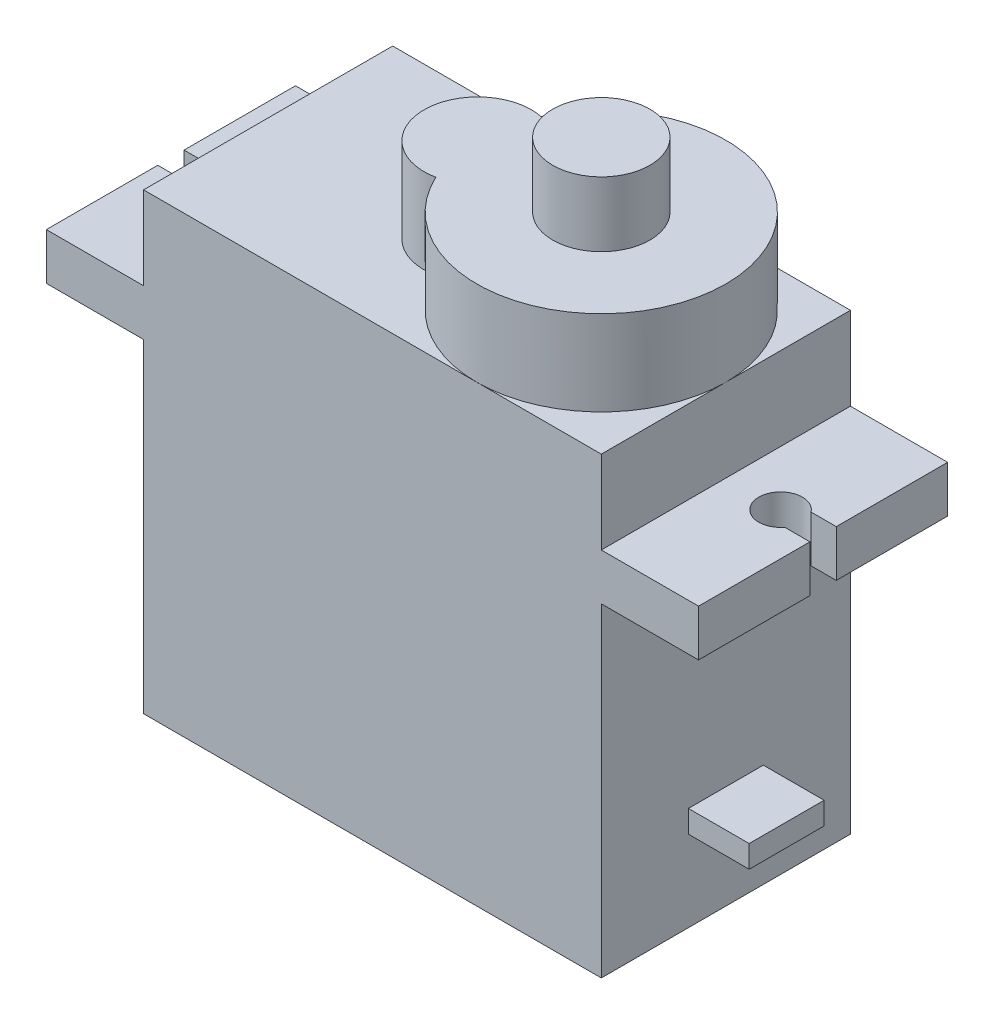
ISO-10303-21;
HEADER;
FILE_DESCRIPTION(('STEP AP214'),'2;1');
FILE_NAME('part.step','',(''),(''),'','','');
FILE_SCHEMA(('AUTOMOTIVE_DESIGN { 1 0 10303 214 1 1 1 1 }'));
ENDSEC;
DATA;
#1=APPLICATION_CONTEXT('core data for automotive mechanical design processes');
#2=APPLICATION_PROTOCOL_DEFINITION('international standard','automotive_design',2000,#1);
#3=PRODUCT_CONTEXT('',#1,'mechanical');
#4=PRODUCT('Part','Part','',(#3));
#5=PRODUCT_RELATED_PRODUCT_CATEGORY('part','',(#4));
#6=PRODUCT_DEFINITION_FORMATION('','',#4);
#7=PRODUCT_DEFINITION_CONTEXT('part definition',#1,'design');
#8=PRODUCT_DEFINITION('design','',#6,#7);
#9=PRODUCT_DEFINITION_SHAPE('','',#8);
#10=(LENGTH_UNIT() NAMED_UNIT(*) SI_UNIT(.MILLI.,.METRE.));
#11=(NAMED_UNIT(*) PLANE_ANGLE_UNIT() SI_UNIT($,.RADIAN.));
#12=(NAMED_UNIT(*) SI_UNIT($,.STERADIAN.) SOLID_ANGLE_UNIT());
#13=UNCERTAINTY_MEASURE_WITH_UNIT(LENGTH_MEASURE(1.E-05),#10,'distance_accuracy_value','');
#14=(GEOMETRIC_REPRESENTATION_CONTEXT(3) GLOBAL_UNCERTAINTY_ASSIGNED_CONTEXT((#13)) GLOBAL_UNIT_ASSIGNED_CONTEXT((#10,
#11,#12)) REPRESENTATION_CONTEXT('',''));
#15=CARTESIAN_POINT('',(0.,0.,0.));
#16=DIRECTION('',(0.,0.,1.));
#17=DIRECTION('',(1.,0.,0.));
#18=AXIS2_PLACEMENT_3D('',#15,#16,#17);
#19=CARTESIAN_POINT('',(11.3,22.4,6.15));
#20=DIRECTION('',(-1.,0.,0.));
#21=DIRECTION('',(0.,0.,1.));
#22=AXIS2_PLACEMENT_3D('',#19,#20,#21);
#23=PLANE('',#22);
#24=DIRECTION('',(0.,0.,-1.));
#25=VECTOR('',#24,1.);
#26=CARTESIAN_POINT('',(11.3,16.,6.15));
#27=LINE('',#26,#25);
#28=CARTESIAN_POINT('',(11.3,16.,6.15));
#29=VERTEX_POINT('',#28);
#30=CARTESIAN_POINT('',(11.3,16.,-6.15));
#31=VERTEX_POINT('',#30);
#32=EDGE_CURVE('E335',#29,#31,#27,.T.);
#33=ORIENTED_EDGE('',*,*,#32,.F.);
#34=DIRECTION('',(0.,-1.,0.));
#35=VECTOR('',#34,1.);
#36=CARTESIAN_POINT('',(11.3,22.4,6.15));
#37=LINE('',#36,#35);
#38=CARTESIAN_POINT('',(11.3,0.,6.15));
#39=VERTEX_POINT('',#38);
#40=EDGE_CURVE('E381',#29,#39,#37,.T.);
#41=ORIENTED_EDGE('',*,*,#40,.T.);
#42=DIRECTION('',(0.,0.,-1.));
#43=VECTOR('',#42,1.);
#44=CARTESIAN_POINT('',(11.3,0.,6.15));
#45=LINE('',#44,#43);
#46=CARTESIAN_POINT('',(11.3,0.,-6.15));
#47=VERTEX_POINT('',#46);
#48=EDGE_CURVE('E366',#39,#47,#45,.T.);
#49=ORIENTED_EDGE('',*,*,#48,.T.);
#50=DIRECTION('',(0.,-1.,0.));
#51=VECTOR('',#50,1.);
#52=CARTESIAN_POINT('',(11.3,22.4,-6.15));
#53=LINE('',#52,#51);
#54=EDGE_CURVE('E403',#31,#47,#53,.T.);
#55=ORIENTED_EDGE('',*,*,#54,.F.);
#56=EDGE_LOOP('',(#33,#41,#49,#55));
#57=FACE_BOUND('',#56,.T.);
#58=DIRECTION('',(0.,-1.,0.));
#59=VECTOR('',#58,1.);
#60=CARTESIAN_POINT('',(11.3,5.1,1.85));
#61=LINE('',#60,#59);
#62=CARTESIAN_POINT('',(11.3,5.1,1.85));
#63=VERTEX_POINT('',#62);
#64=CARTESIAN_POINT('',(11.3,4.,1.85));
#65=VERTEX_POINT('',#64);
#66=EDGE_CURVE('E239',#63,#65,#61,.T.);
#67=ORIENTED_EDGE('',*,*,#66,.F.);
#68=DIRECTION('',(0.,0.,1.));
#69=VECTOR('',#68,1.);
#70=CARTESIAN_POINT('',(11.3,5.1,1.85));
#71=LINE('',#70,#69);
#72=CARTESIAN_POINT('',(11.3,5.1,-1.85));
#73=VERTEX_POINT('',#72);
#74=EDGE_CURVE('E236',#73,#63,#71,.T.);
#75=ORIENTED_EDGE('',*,*,#74,.F.);
#76=DIRECTION('',(0.,1.,0.));
#77=VECTOR('',#76,1.);
#78=CARTESIAN_POINT('',(11.3,5.1,-1.85));
#79=LINE('',#78,#77);
#80=CARTESIAN_POINT('',(11.3,4.,-1.85));
#81=VERTEX_POINT('',#80);
#82=EDGE_CURVE('E57',#81,#73,#79,.T.);
#83=ORIENTED_EDGE('',*,*,#82,.F.);
#84=DIRECTION('',(0.,0.,-1.));
#85=VECTOR('',#84,1.);
#86=CARTESIAN_POINT('',(11.3,4.,1.85));
#87=LINE('',#86,#85);
#88=EDGE_CURVE('E52',#65,#81,#87,.T.);
#89=ORIENTED_EDGE('',*,*,#88,.F.);
#90=EDGE_LOOP('',(#67,#75,#83,#89));
#91=FACE_BOUND('',#90,.T.);
#92=ADVANCED_FACE('F34',(#57,#91),#23,.F.);
#93=CARTESIAN_POINT('',(0.,22.4,0.));
#94=DIRECTION('',(0.,-1.,0.));
#95=DIRECTION('',(0.,0.,-1.));
#96=AXIS2_PLACEMENT_3D('',#93,#94,#95);
#97=PLANE('',#96);
#98=CARTESIAN_POINT('',(-0.950000000000001,22.4,0.));
#99=DIRECTION('',(0.,1.,0.));
#100=DIRECTION('',(0.,0.,1.));
#101=AXIS2_PLACEMENT_3D('',#98,#99,#100);
#102=CIRCLE('',#101,2.65);
#103=CARTESIAN_POINT('',(-0.42459016393443,22.4,-2.59739186573099));
#104=VERTEX_POINT('',#103);
#105=CARTESIAN_POINT('',(-0.424590163934428,22.4,2.597391865731));
#106=VERTEX_POINT('',#105);
#107=EDGE_CURVE('E250',#104,#106,#102,.T.);
#108=ORIENTED_EDGE('',*,*,#107,.F.);
#109=CARTESIAN_POINT('',(5.15,22.4,0.));
#110=DIRECTION('',(0.,1.,0.));
#111=DIRECTION('',(0.,0.,1.));
#112=AXIS2_PLACEMENT_3D('',#109,#110,#111);
#113=CIRCLE('',#112,6.15);
#114=CARTESIAN_POINT('',(5.15,22.4,-6.15));
#115=VERTEX_POINT('',#114);
#116=EDGE_CURVE('E261',#115,#104,#113,.T.);
#117=ORIENTED_EDGE('',*,*,#116,.F.);
#118=DIRECTION('',(-1.,0.,0.));
#119=VECTOR('',#118,1.);
#120=CARTESIAN_POINT('',(-11.3,22.4,-6.15));
#121=LINE('',#120,#119);
#122=CARTESIAN_POINT('',(-11.3,22.4,-6.15));
#123=VERTEX_POINT('',#122);
#124=EDGE_CURVE('E370',#115,#123,#121,.T.);
#125=ORIENTED_EDGE('',*,*,#124,.T.);
#126=DIRECTION('',(0.,0.,1.));
#127=VECTOR('',#126,1.);
#128=CARTESIAN_POINT('',(-11.3,22.4,6.15));
#129=LINE('',#128,#127);
#130=CARTESIAN_POINT('',(-11.3,22.4,6.15));
#131=VERTEX_POINT('',#130);
#132=EDGE_CURVE('E375',#123,#131,#129,.T.);
#133=ORIENTED_EDGE('',*,*,#132,.T.);
#134=DIRECTION('',(1.,0.,0.));
#135=VECTOR('',#134,1.);
#136=CARTESIAN_POINT('',(-11.3,22.4,6.15));
#137=LINE('',#136,#135);
#138=CARTESIAN_POINT('',(5.15,22.4,6.15));
#139=VERTEX_POINT('',#138);
#140=EDGE_CURVE('E378',#131,#139,#137,.T.);
#141=ORIENTED_EDGE('',*,*,#140,.T.);
#142=EDGE_CURVE('E45',#106,#139,#113,.T.);
#143=ORIENTED_EDGE('',*,*,#142,.F.);
#144=EDGE_LOOP('',(#108,#117,#125,#133,#141,#143));
#145=FACE_BOUND('',#144,.T.);
#146=ADVANCED_FACE('F455',(#145),#97,.F.);
#147=CARTESIAN_POINT('',(11.3,22.4,0.));
#148=VERTEX_POINT('',#147);
#149=EDGE_CURVE('E11',#139,#148,#113,.T.);
#150=ORIENTED_EDGE('',*,*,#149,.F.);
#151=CARTESIAN_POINT('',(11.3,22.4,6.15));
#152=VERTEX_POINT('',#151);
#153=EDGE_CURVE('E377',#139,#152,#137,.T.);
#154=ORIENTED_EDGE('',*,*,#153,.T.);
#155=DIRECTION('',(0.,0.,-1.));
#156=VECTOR('',#155,1.);
#157=CARTESIAN_POINT('',(11.3,22.4,6.15));
#158=LINE('',#157,#156);
#159=EDGE_CURVE('E367',#152,#148,#158,.T.);
#160=ORIENTED_EDGE('',*,*,#159,.T.);
#161=EDGE_LOOP('',(#150,#154,#160));
#162=FACE_BOUND('',#161,.T.);
#163=ADVANCED_FACE('F433',(#162),#97,.F.);
#164=CARTESIAN_POINT('',(-16.1,18.3,6.15));
#165=DIRECTION('',(0.,1.,0.));
#166=DIRECTION('',(0.,0.,1.));
#167=AXIS2_PLACEMENT_3D('',#164,#165,#166);
#168=PLANE('',#167);
#169=CARTESIAN_POINT('',(-14.,18.3,0.));
#170=DIRECTION('',(0.,-1.,0.));
#171=DIRECTION('',(0.,0.,1.));
#172=AXIS2_PLACEMENT_3D('',#169,#170,#171);
#173=CIRCLE('',#172,1.075);
#174=CARTESIAN_POINT('',(-14.8562271894772,18.3,-0.65));
#175=VERTEX_POINT('',#174);
#176=CARTESIAN_POINT('',(-14.8562271894772,18.3,0.65));
#177=VERTEX_POINT('',#176);
#178=EDGE_CURVE('E267',#175,#177,#173,.T.);
#179=ORIENTED_EDGE('',*,*,#178,.T.);
#180=DIRECTION('',(-1.,0.,0.));
#181=VECTOR('',#180,1.);
#182=CARTESIAN_POINT('',(-14.8562271894772,18.3,0.65));
#183=LINE('',#182,#181);
#184=CARTESIAN_POINT('',(-16.1,18.3,0.65));
#185=VERTEX_POINT('',#184);
#186=EDGE_CURVE('E273',#177,#185,#183,.T.);
#187=ORIENTED_EDGE('',*,*,#186,.T.);
#188=DIRECTION('',(0.,0.,1.));
#189=VECTOR('',#188,1.);
#190=CARTESIAN_POINT('',(-16.1,18.3,6.15));
#191=LINE('',#190,#189);
#192=CARTESIAN_POINT('',(-16.1,18.3,6.15));
#193=VERTEX_POINT('',#192);
#194=EDGE_CURVE('E290',#185,#193,#191,.T.);
#195=ORIENTED_EDGE('',*,*,#194,.T.);
#196=DIRECTION('',(1.,0.,0.));
#197=VECTOR('',#196,1.);
#198=CARTESIAN_POINT('',(-16.1,18.3,6.15));
#199=LINE('',#198,#197);
#200=CARTESIAN_POINT('',(-11.3,18.3,6.15));
#201=VERTEX_POINT('',#200);
#202=EDGE_CURVE('E312',#193,#201,#199,.T.);
#203=ORIENTED_EDGE('',*,*,#202,.T.);
#204=DIRECTION('',(0.,0.,1.));
#205=VECTOR('',#204,1.);
#206=CARTESIAN_POINT('',(-11.3,18.3,6.15));
#207=LINE('',#206,#205);
#208=CARTESIAN_POINT('',(-11.3,18.3,-6.15));
#209=VERTEX_POINT('',#208);
#210=EDGE_CURVE('E286',#209,#201,#207,.T.);
#211=ORIENTED_EDGE('',*,*,#210,.F.);
#212=DIRECTION('',(1.,0.,0.));
#213=VECTOR('',#212,1.);
#214=CARTESIAN_POINT('',(-16.1,18.3,-6.15));
#215=LINE('',#214,#213);
#216=CARTESIAN_POINT('',(-16.1,18.3,-6.15));
#217=VERTEX_POINT('',#216);
#218=EDGE_CURVE('E310',#217,#209,#215,.T.);
#219=ORIENTED_EDGE('',*,*,#218,.F.);
#220=CARTESIAN_POINT('',(-16.1,18.3,-0.65));
#221=VERTEX_POINT('',#220);
#222=EDGE_CURVE('E292',#217,#221,#191,.T.);
#223=ORIENTED_EDGE('',*,*,#222,.T.);
#224=DIRECTION('',(1.,0.,0.));
#225=VECTOR('',#224,1.);
#226=CARTESIAN_POINT('',(-14.8562271894772,18.3,-0.65));
#227=LINE('',#226,#225);
#228=EDGE_CURVE('E270',#221,#175,#227,.T.);
#229=ORIENTED_EDGE('',*,*,#228,.T.);
#230=EDGE_LOOP('',(#179,#187,#195,#203,#211,#219,#223,#229));
#231=FACE_BOUND('',#230,.T.);
#232=ADVANCED_FACE('F539',(#231),#168,.T.);
#233=CARTESIAN_POINT('',(-16.1,16.,6.15));
#234=DIRECTION('',(0.,-1.,0.));
#235=DIRECTION('',(0.,0.,-1.));
#236=AXIS2_PLACEMENT_3D('',#233,#234,#235);
#237=PLANE('',#236);
#238=DIRECTION('',(0.,0.,-1.));
#239=VECTOR('',#238,1.);
#240=CARTESIAN_POINT('',(-16.1,16.,6.15));
#241=LINE('',#240,#239);
#242=CARTESIAN_POINT('',(-16.1,16.,6.15));
#243=VERTEX_POINT('',#242);
#244=CARTESIAN_POINT('',(-16.1,16.,0.65));
#245=VERTEX_POINT('',#244);
#246=EDGE_CURVE('E299',#243,#245,#241,.T.);
#247=ORIENTED_EDGE('',*,*,#246,.T.);
#248=DIRECTION('',(1.,0.,0.));
#249=VECTOR('',#248,1.);
#250=CARTESIAN_POINT('',(-16.1,16.,0.65));
#251=LINE('',#250,#249);
#252=CARTESIAN_POINT('',(-14.8562271894772,16.,0.65));
#253=VERTEX_POINT('',#252);
#254=EDGE_CURVE('E283',#245,#253,#251,.T.);
#255=ORIENTED_EDGE('',*,*,#254,.T.);
#256=CARTESIAN_POINT('',(-14.,16.,0.));
#257=DIRECTION('',(0.,-1.,0.));
#258=DIRECTION('',(0.,0.,-1.));
#259=AXIS2_PLACEMENT_3D('',#256,#257,#258);
#260=CIRCLE('',#259,1.075);
#261=CARTESIAN_POINT('',(-14.8562271894772,16.,-0.65));
#262=VERTEX_POINT('',#261);
#263=EDGE_CURVE('E38',#253,#262,#260,.F.);
#264=ORIENTED_EDGE('',*,*,#263,.T.);
#265=DIRECTION('',(-1.,0.,0.));
#266=VECTOR('',#265,1.);
#267=CARTESIAN_POINT('',(-16.1,16.,-0.65));
#268=LINE('',#267,#266);
#269=CARTESIAN_POINT('',(-16.1,16.,-0.65));
#270=VERTEX_POINT('',#269);
#271=EDGE_CURVE('E279',#262,#270,#268,.T.);
#272=ORIENTED_EDGE('',*,*,#271,.T.);
#273=CARTESIAN_POINT('',(-16.1,16.,-6.15));
#274=VERTEX_POINT('',#273);
#275=EDGE_CURVE('E298',#270,#274,#241,.T.);
#276=ORIENTED_EDGE('',*,*,#275,.T.);
#277=DIRECTION('',(1.,0.,0.));
#278=VECTOR('',#277,1.);
#279=CARTESIAN_POINT('',(-16.1,16.,-6.15));
#280=LINE('',#279,#278);
#281=CARTESIAN_POINT('',(-11.3,16.,-6.15));
#282=VERTEX_POINT('',#281);
#283=EDGE_CURVE('E308',#274,#282,#280,.T.);
#284=ORIENTED_EDGE('',*,*,#283,.T.);
#285=DIRECTION('',(0.,0.,-1.));
#286=VECTOR('',#285,1.);
#287=CARTESIAN_POINT('',(-11.3,16.,6.15));
#288=LINE('',#287,#286);
#289=CARTESIAN_POINT('',(-11.3,16.,6.15));
#290=VERTEX_POINT('',#289);
#291=EDGE_CURVE('E291',#290,#282,#288,.T.);
#292=ORIENTED_EDGE('',*,*,#291,.F.);
#293=DIRECTION('',(1.,0.,0.));
#294=VECTOR('',#293,1.);
#295=CARTESIAN_POINT('',(-16.1,16.,6.15));
#296=LINE('',#295,#294);
#297=EDGE_CURVE('E302',#243,#290,#296,.T.);
#298=ORIENTED_EDGE('',*,*,#297,.F.);
#299=EDGE_LOOP('',(#247,#255,#264,#272,#276,#284,#292,#298));
#300=FACE_BOUND('',#299,.T.);
#301=ADVANCED_FACE('F545',(#300),#237,.T.);
#302=CARTESIAN_POINT('',(-16.1,0.,0.));
#303=DIRECTION('',(-1.,0.,0.));
#304=DIRECTION('',(0.,0.,-1.));
#305=AXIS2_PLACEMENT_3D('',#302,#303,#304);
#306=PLANE('',#305);
#307=ORIENTED_EDGE('',*,*,#194,.F.);
#308=DIRECTION('',(0.,-1.,0.));
#309=VECTOR('',#308,1.);
#310=CARTESIAN_POINT('',(-16.1,0.,0.65));
#311=LINE('',#310,#309);
#312=EDGE_CURVE('E413',#185,#245,#311,.T.);
#313=ORIENTED_EDGE('',*,*,#312,.T.);
#314=ORIENTED_EDGE('',*,*,#246,.F.);
#315=DIRECTION('',(0.,-1.,0.));
#316=VECTOR('',#315,1.);
#317=CARTESIAN_POINT('',(-16.1,18.3,6.15));
#318=LINE('',#317,#316);
#319=EDGE_CURVE('E287',#193,#243,#318,.T.);
#320=ORIENTED_EDGE('',*,*,#319,.F.);
#321=EDGE_LOOP('',(#307,#313,#314,#320));
#322=FACE_BOUND('',#321,.T.);
#323=ADVANCED_FACE('F544',(#322),#306,.T.);
#324=ORIENTED_EDGE('',*,*,#275,.F.);
#325=DIRECTION('',(0.,1.,0.));
#326=VECTOR('',#325,1.);
#327=CARTESIAN_POINT('',(-16.1,0.,-0.65));
#328=LINE('',#327,#326);
#329=EDGE_CURVE('E411',#270,#221,#328,.T.);
#330=ORIENTED_EDGE('',*,*,#329,.T.);
#331=ORIENTED_EDGE('',*,*,#222,.F.);
#332=DIRECTION('',(0.,1.,0.));
#333=VECTOR('',#332,1.);
#334=CARTESIAN_POINT('',(-16.1,18.3,-6.15));
#335=LINE('',#334,#333);
#336=EDGE_CURVE('E295',#274,#217,#335,.T.);
#337=ORIENTED_EDGE('',*,*,#336,.F.);
#338=EDGE_LOOP('',(#324,#330,#331,#337));
#339=FACE_BOUND('',#338,.T.);
#340=ADVANCED_FACE('F496',(#339),#306,.T.);
#341=CARTESIAN_POINT('',(-11.3,22.4,6.15));
#342=DIRECTION('',(1.,0.,0.));
#343=DIRECTION('',(0.,0.,-1.));
#344=AXIS2_PLACEMENT_3D('',#341,#342,#343);
#345=PLANE('',#344);
#346=DIRECTION('',(0.,-1.,0.));
#347=VECTOR('',#346,1.);
#348=CARTESIAN_POINT('',(-11.3,22.4,6.15));
#349=LINE('',#348,#347);
#350=CARTESIAN_POINT('',(-11.3,0.,6.15));
#351=VERTEX_POINT('',#350);
#352=EDGE_CURVE('E395',#290,#351,#349,.T.);
#353=ORIENTED_EDGE('',*,*,#352,.F.);
#354=ORIENTED_EDGE('',*,*,#291,.T.);
#355=DIRECTION('',(0.,-1.,0.));
#356=VECTOR('',#355,1.);
#357=CARTESIAN_POINT('',(-11.3,22.4,-6.15));
#358=LINE('',#357,#356);
#359=CARTESIAN_POINT('',(-11.3,0.,-6.15));
#360=VERTEX_POINT('',#359);
#361=EDGE_CURVE('E399',#282,#360,#358,.T.);
#362=ORIENTED_EDGE('',*,*,#361,.T.);
#363=DIRECTION('',(0.,0.,1.));
#364=VECTOR('',#363,1.);
#365=CARTESIAN_POINT('',(-11.3,0.,6.15));
#366=LINE('',#365,#364);
#367=EDGE_CURVE('E387',#360,#351,#366,.T.);
#368=ORIENTED_EDGE('',*,*,#367,.T.);
#369=EDGE_LOOP('',(#353,#354,#362,#368));
#370=FACE_BOUND('',#369,.T.);
#371=ADVANCED_FACE('F489',(#370),#345,.F.);
#372=CARTESIAN_POINT('',(16.1,0.,0.));
#373=DIRECTION('',(1.,0.,0.));
#374=DIRECTION('',(0.,0.,-1.));
#375=AXIS2_PLACEMENT_3D('',#372,#373,#374);
#376=PLANE('',#375);
#377=DIRECTION('',(0.,1.,0.));
#378=VECTOR('',#377,1.);
#379=CARTESIAN_POINT('',(16.1,0.,-0.65));
#380=LINE('',#379,#378);
#381=CARTESIAN_POINT('',(16.1,16.,-0.65));
#382=VERTEX_POINT('',#381);
#383=CARTESIAN_POINT('',(16.1,18.3,-0.65));
#384=VERTEX_POINT('',#383);
#385=EDGE_CURVE('E409',#382,#384,#380,.T.);
#386=ORIENTED_EDGE('',*,*,#385,.F.);
#387=DIRECTION('',(0.,0.,-1.));
#388=VECTOR('',#387,1.);
#389=CARTESIAN_POINT('',(16.1,16.,6.15));
#390=LINE('',#389,#388);
#391=CARTESIAN_POINT('',(16.1,16.,-6.15));
#392=VERTEX_POINT('',#391);
#393=EDGE_CURVE('E339',#382,#392,#390,.T.);
#394=ORIENTED_EDGE('',*,*,#393,.T.);
#395=DIRECTION('',(0.,1.,0.));
#396=VECTOR('',#395,1.);
#397=CARTESIAN_POINT('',(16.1,18.3,-6.15));
#398=LINE('',#397,#396);
#399=CARTESIAN_POINT('',(16.1,18.3,-6.15));
#400=VERTEX_POINT('',#399);
#401=EDGE_CURVE('E344',#392,#400,#398,.T.);
#402=ORIENTED_EDGE('',*,*,#401,.T.);
#403=DIRECTION('',(0.,0.,1.));
#404=VECTOR('',#403,1.);
#405=CARTESIAN_POINT('',(16.1,18.3,6.15));
#406=LINE('',#405,#404);
#407=EDGE_CURVE('E347',#400,#384,#406,.T.);
#408=ORIENTED_EDGE('',*,*,#407,.T.);
#409=EDGE_LOOP('',(#386,#394,#402,#408));
#410=FACE_BOUND('',#409,.T.);
#411=ADVANCED_FACE('F483',(#410),#376,.T.);
#412=DIRECTION('',(0.,0.,1.));
#413=VECTOR('',#412,1.);
#414=CARTESIAN_POINT('',(11.3,18.3,6.15));
#415=LINE('',#414,#413);
#416=CARTESIAN_POINT('',(11.3,18.3,-6.15));
#417=VERTEX_POINT('',#416);
#418=CARTESIAN_POINT('',(11.3,18.3,6.15));
#419=VERTEX_POINT('',#418);
#420=EDGE_CURVE('E340',#417,#419,#415,.T.);
#421=ORIENTED_EDGE('',*,*,#420,.F.);
#422=CARTESIAN_POINT('',(11.3,22.4,-6.15));
#423=VERTEX_POINT('',#422);
#424=EDGE_CURVE('E404',#423,#417,#53,.T.);
#425=ORIENTED_EDGE('',*,*,#424,.F.);
#426=EDGE_CURVE('E371',#148,#423,#158,.T.);
#427=ORIENTED_EDGE('',*,*,#426,.F.);
#428=ORIENTED_EDGE('',*,*,#159,.F.);
#429=EDGE_CURVE('E393',#152,#419,#37,.T.);
#430=ORIENTED_EDGE('',*,*,#429,.T.);
#431=EDGE_LOOP('',(#421,#425,#427,#428,#430));
#432=FACE_BOUND('',#431,.T.);
#433=ADVANCED_FACE('F36',(#432),#23,.F.);
#434=CARTESIAN_POINT('',(-11.3,22.4,-6.15));
#435=DIRECTION('',(0.,0.,1.));
#436=DIRECTION('',(1.,0.,0.));
#437=AXIS2_PLACEMENT_3D('',#434,#435,#436);
#438=PLANE('',#437);
#439=DIRECTION('',(-1.,0.,0.));
#440=VECTOR('',#439,1.);
#441=CARTESIAN_POINT('',(-11.3,0.,-6.15));
#442=LINE('',#441,#440);
#443=EDGE_CURVE('E384',#47,#360,#442,.T.);
#444=ORIENTED_EDGE('',*,*,#443,.T.);
#445=ORIENTED_EDGE('',*,*,#361,.F.);
#446=ORIENTED_EDGE('',*,*,#283,.F.);
#447=ORIENTED_EDGE('',*,*,#336,.T.);
#448=ORIENTED_EDGE('',*,*,#218,.T.);
#449=EDGE_CURVE('E400',#123,#209,#358,.T.);
#450=ORIENTED_EDGE('',*,*,#449,.F.);
#451=ORIENTED_EDGE('',*,*,#124,.F.);
#452=EDGE_CURVE('E372',#423,#115,#121,.T.);
#453=ORIENTED_EDGE('',*,*,#452,.F.);
#454=ORIENTED_EDGE('',*,*,#424,.T.);
#455=DIRECTION('',(-1.,0.,0.));
#456=VECTOR('',#455,1.);
#457=CARTESIAN_POINT('',(16.1,18.3,-6.15));
#458=LINE('',#457,#456);
#459=EDGE_CURVE('E357',#400,#417,#458,.T.);
#460=ORIENTED_EDGE('',*,*,#459,.F.);
#461=ORIENTED_EDGE('',*,*,#401,.F.);
#462=DIRECTION('',(-1.,0.,0.));
#463=VECTOR('',#462,1.);
#464=CARTESIAN_POINT('',(16.1,16.,-6.15));
#465=LINE('',#464,#463);
#466=EDGE_CURVE('E360',#392,#31,#465,.T.);
#467=ORIENTED_EDGE('',*,*,#466,.T.);
#468=ORIENTED_EDGE('',*,*,#54,.T.);
#469=EDGE_LOOP('',(#444,#445,#446,#447,#448,#450,#451,#453,#454,#460,#461,#467,#468));
#470=FACE_BOUND('',#469,.T.);
#471=ADVANCED_FACE('F450',(#470),#438,.F.);
#472=ORIENTED_EDGE('',*,*,#449,.T.);
#473=ORIENTED_EDGE('',*,*,#210,.T.);
#474=EDGE_CURVE('E396',#131,#201,#349,.T.);
#475=ORIENTED_EDGE('',*,*,#474,.F.);
#476=ORIENTED_EDGE('',*,*,#132,.F.);
#477=EDGE_LOOP('',(#472,#473,#475,#476));
#478=FACE_BOUND('',#477,.T.);
#479=ADVANCED_FACE('F488',(#478),#345,.F.);
#480=CARTESIAN_POINT('',(-11.3,22.4,6.15));
#481=DIRECTION('',(0.,0.,-1.));
#482=DIRECTION('',(-1.,0.,0.));
#483=AXIS2_PLACEMENT_3D('',#480,#481,#482);
#484=PLANE('',#483);
#485=DIRECTION('',(1.,0.,0.));
#486=VECTOR('',#485,1.);
#487=CARTESIAN_POINT('',(-11.3,0.,6.15));
#488=LINE('',#487,#486);
#489=EDGE_CURVE('E390',#351,#39,#488,.T.);
#490=ORIENTED_EDGE('',*,*,#489,.T.);
#491=ORIENTED_EDGE('',*,*,#40,.F.);
#492=DIRECTION('',(-1.,0.,0.));
#493=VECTOR('',#492,1.);
#494=CARTESIAN_POINT('',(16.1,16.,6.15));
#495=LINE('',#494,#493);
#496=CARTESIAN_POINT('',(16.1,16.,6.15));
#497=VERTEX_POINT('',#496);
#498=EDGE_CURVE('E363',#497,#29,#495,.T.);
#499=ORIENTED_EDGE('',*,*,#498,.F.);
#500=DIRECTION('',(0.,-1.,0.));
#501=VECTOR('',#500,1.);
#502=CARTESIAN_POINT('',(16.1,18.3,6.15));
#503=LINE('',#502,#501);
#504=CARTESIAN_POINT('',(16.1,18.3,6.15));
#505=VERTEX_POINT('',#504);
#506=EDGE_CURVE('E336',#505,#497,#503,.T.);
#507=ORIENTED_EDGE('',*,*,#506,.F.);
#508=DIRECTION('',(-1.,0.,0.));
#509=VECTOR('',#508,1.);
#510=CARTESIAN_POINT('',(16.1,18.3,6.15));
#511=LINE('',#510,#509);
#512=EDGE_CURVE('E350',#505,#419,#511,.T.);
#513=ORIENTED_EDGE('',*,*,#512,.T.);
#514=ORIENTED_EDGE('',*,*,#429,.F.);
#515=ORIENTED_EDGE('',*,*,#153,.F.);
#516=ORIENTED_EDGE('',*,*,#140,.F.);
#517=ORIENTED_EDGE('',*,*,#474,.T.);
#518=ORIENTED_EDGE('',*,*,#202,.F.);
#519=ORIENTED_EDGE('',*,*,#319,.T.);
#520=ORIENTED_EDGE('',*,*,#297,.T.);
#521=ORIENTED_EDGE('',*,*,#352,.T.);
#522=EDGE_LOOP('',(#490,#491,#499,#507,#513,#514,#515,#516,#517,#518,#519,#520,#521));
#523=FACE_BOUND('',#522,.T.);
#524=ADVANCED_FACE('F438',(#523),#484,.F.);
#525=EDGE_CURVE('E43',#148,#115,#113,.T.);
#526=ORIENTED_EDGE('',*,*,#525,.F.);
#527=ORIENTED_EDGE('',*,*,#426,.T.);
#528=ORIENTED_EDGE('',*,*,#452,.T.);
#529=EDGE_LOOP('',(#526,#527,#528));
#530=FACE_BOUND('',#529,.T.);
#531=ADVANCED_FACE('F427',(#530),#97,.F.);
#532=CARTESIAN_POINT('',(0.,0.,0.));
#533=DIRECTION('',(0.,-1.,0.));
#534=DIRECTION('',(0.,0.,-1.));
#535=AXIS2_PLACEMENT_3D('',#532,#533,#534);
#536=PLANE('',#535);
#537=ORIENTED_EDGE('',*,*,#48,.F.);
#538=ORIENTED_EDGE('',*,*,#489,.F.);
#539=ORIENTED_EDGE('',*,*,#367,.F.);
#540=ORIENTED_EDGE('',*,*,#443,.F.);
#541=EDGE_LOOP('',(#537,#538,#539,#540));
#542=FACE_BOUND('',#541,.T.);
#543=ADVANCED_FACE('F527',(#542),#536,.T.);
#544=CARTESIAN_POINT('',(16.1,16.,6.15));
#545=DIRECTION('',(0.,1.,0.));
#546=DIRECTION('',(0.,0.,1.));
#547=AXIS2_PLACEMENT_3D('',#544,#545,#546);
#548=PLANE('',#547);
#549=ORIENTED_EDGE('',*,*,#393,.F.);
#550=DIRECTION('',(-1.,0.,0.));
#551=VECTOR('',#550,1.);
#552=CARTESIAN_POINT('',(16.1,16.,-0.65));
#553=LINE('',#552,#551);
#554=CARTESIAN_POINT('',(14.8562271894772,16.,-0.65));
#555=VERTEX_POINT('',#554);
#556=EDGE_CURVE('E329',#382,#555,#553,.T.);
#557=ORIENTED_EDGE('',*,*,#556,.T.);
#558=CARTESIAN_POINT('',(14.,16.,0.));
#559=DIRECTION('',(0.,1.,0.));
#560=DIRECTION('',(0.,0.,1.));
#561=AXIS2_PLACEMENT_3D('',#558,#559,#560);
#562=CIRCLE('',#561,1.075);
#563=CARTESIAN_POINT('',(14.8562271894772,16.,0.65));
#564=VERTEX_POINT('',#563);
#565=EDGE_CURVE('E332',#555,#564,#562,.T.);
#566=ORIENTED_EDGE('',*,*,#565,.T.);
#567=DIRECTION('',(1.,0.,0.));
#568=VECTOR('',#567,1.);
#569=CARTESIAN_POINT('',(16.1,16.,0.65));
#570=LINE('',#569,#568);
#571=CARTESIAN_POINT('',(16.1,16.,0.65));
#572=VERTEX_POINT('',#571);
#573=EDGE_CURVE('E325',#564,#572,#570,.T.);
#574=ORIENTED_EDGE('',*,*,#573,.T.);
#575=EDGE_CURVE('E341',#497,#572,#390,.T.);
#576=ORIENTED_EDGE('',*,*,#575,.F.);
#577=ORIENTED_EDGE('',*,*,#498,.T.);
#578=ORIENTED_EDGE('',*,*,#32,.T.);
#579=ORIENTED_EDGE('',*,*,#466,.F.);
#580=EDGE_LOOP('',(#549,#557,#566,#574,#576,#577,#578,#579));
#581=FACE_BOUND('',#580,.T.);
#582=ADVANCED_FACE('F511',(#581),#548,.F.);
#583=CARTESIAN_POINT('',(16.1,18.3,6.15));
#584=DIRECTION('',(0.,-1.,0.));
#585=DIRECTION('',(0.,0.,-1.));
#586=AXIS2_PLACEMENT_3D('',#583,#584,#585);
#587=PLANE('',#586);
#588=CARTESIAN_POINT('',(14.,18.3,0.));
#589=DIRECTION('',(0.,1.,0.));
#590=DIRECTION('',(0.,0.,1.));
#591=AXIS2_PLACEMENT_3D('',#588,#589,#590);
#592=CIRCLE('',#591,1.075);
#593=CARTESIAN_POINT('',(14.8562271894772,18.3,-0.65));
#594=VERTEX_POINT('',#593);
#595=CARTESIAN_POINT('',(14.8562271894772,18.3,0.65));
#596=VERTEX_POINT('',#595);
#597=EDGE_CURVE('E314',#594,#596,#592,.T.);
#598=ORIENTED_EDGE('',*,*,#597,.F.);
#599=DIRECTION('',(-1.,0.,0.));
#600=VECTOR('',#599,1.);
#601=CARTESIAN_POINT('',(14.8562271894772,18.3,-0.65));
#602=LINE('',#601,#600);
#603=EDGE_CURVE('E319',#384,#594,#602,.T.);
#604=ORIENTED_EDGE('',*,*,#603,.F.);
#605=ORIENTED_EDGE('',*,*,#407,.F.);
#606=ORIENTED_EDGE('',*,*,#459,.T.);
#607=ORIENTED_EDGE('',*,*,#420,.T.);
#608=ORIENTED_EDGE('',*,*,#512,.F.);
#609=CARTESIAN_POINT('',(16.1,18.3,0.65));
#610=VERTEX_POINT('',#609);
#611=EDGE_CURVE('E346',#610,#505,#406,.T.);
#612=ORIENTED_EDGE('',*,*,#611,.F.);
#613=DIRECTION('',(1.,0.,0.));
#614=VECTOR('',#613,1.);
#615=CARTESIAN_POINT('',(14.8562271894772,18.3,0.65));
#616=LINE('',#615,#614);
#617=EDGE_CURVE('E317',#596,#610,#616,.T.);
#618=ORIENTED_EDGE('',*,*,#617,.F.);
#619=EDGE_LOOP('',(#598,#604,#605,#606,#607,#608,#612,#618));
#620=FACE_BOUND('',#619,.T.);
#621=ADVANCED_FACE('F443',(#620),#587,.F.);
#622=DIRECTION('',(0.,-1.,0.));
#623=VECTOR('',#622,1.);
#624=CARTESIAN_POINT('',(16.1,0.,0.65));
#625=LINE('',#624,#623);
#626=EDGE_CURVE('E407',#610,#572,#625,.T.);
#627=ORIENTED_EDGE('',*,*,#626,.F.);
#628=ORIENTED_EDGE('',*,*,#611,.T.);
#629=ORIENTED_EDGE('',*,*,#506,.T.);
#630=ORIENTED_EDGE('',*,*,#575,.T.);
#631=EDGE_LOOP('',(#627,#628,#629,#630));
#632=FACE_BOUND('',#631,.T.);
#633=ADVANCED_FACE('F492',(#632),#376,.T.);
#634=CARTESIAN_POINT('',(14.,0.,0.));
#635=DIRECTION('',(0.,1.,0.));
#636=DIRECTION('',(0.,0.,1.));
#637=AXIS2_PLACEMENT_3D('',#634,#635,#636);
#638=CYLINDRICAL_SURFACE('',#637,1.075);
#639=DIRECTION('',(0.,1.,0.));
#640=VECTOR('',#639,1.);
#641=CARTESIAN_POINT('',(14.8562271894772,0.,-0.65));
#642=LINE('',#641,#640);
#643=EDGE_CURVE('E323',#555,#594,#642,.T.);
#644=ORIENTED_EDGE('',*,*,#643,.T.);
#645=ORIENTED_EDGE('',*,*,#597,.T.);
#646=DIRECTION('',(0.,1.,0.));
#647=VECTOR('',#646,1.);
#648=CARTESIAN_POINT('',(14.8562271894772,0.,0.65));
#649=LINE('',#648,#647);
#650=EDGE_CURVE('E322',#564,#596,#649,.T.);
#651=ORIENTED_EDGE('',*,*,#650,.F.);
#652=ORIENTED_EDGE('',*,*,#565,.F.);
#653=EDGE_LOOP('',(#644,#645,#651,#652));
#654=FACE_BOUND('',#653,.T.);
#655=ADVANCED_FACE('F503',(#654),#638,.F.);
#656=CARTESIAN_POINT('',(14.8562271894772,0.,-0.65));
#657=DIRECTION('',(0.,0.,-1.));
#658=DIRECTION('',(-1.,0.,0.));
#659=AXIS2_PLACEMENT_3D('',#656,#657,#658);
#660=PLANE('',#659);
#661=ORIENTED_EDGE('',*,*,#385,.T.);
#662=ORIENTED_EDGE('',*,*,#603,.T.);
#663=ORIENTED_EDGE('',*,*,#643,.F.);
#664=ORIENTED_EDGE('',*,*,#556,.F.);
#665=EDGE_LOOP('',(#661,#662,#663,#664));
#666=FACE_BOUND('',#665,.T.);
#667=ADVANCED_FACE('F509',(#666),#660,.F.);
#668=CARTESIAN_POINT('',(14.8562271894772,0.,0.65));
#669=DIRECTION('',(0.,0.,1.));
#670=DIRECTION('',(1.,0.,0.));
#671=AXIS2_PLACEMENT_3D('',#668,#669,#670);
#672=PLANE('',#671);
#673=ORIENTED_EDGE('',*,*,#650,.T.);
#674=ORIENTED_EDGE('',*,*,#617,.T.);
#675=ORIENTED_EDGE('',*,*,#626,.T.);
#676=ORIENTED_EDGE('',*,*,#573,.F.);
#677=EDGE_LOOP('',(#673,#674,#675,#676));
#678=FACE_BOUND('',#677,.T.);
#679=ADVANCED_FACE('F515',(#678),#672,.F.);
#680=CARTESIAN_POINT('',(-14.,0.,0.));
#681=DIRECTION('',(0.,1.,0.));
#682=DIRECTION('',(0.,0.,1.));
#683=AXIS2_PLACEMENT_3D('',#680,#681,#682);
#684=CYLINDRICAL_SURFACE('',#683,1.075);
#685=DIRECTION('',(0.,1.,0.));
#686=VECTOR('',#685,1.);
#687=CARTESIAN_POINT('',(-14.8562271894772,0.,0.65));
#688=LINE('',#687,#686);
#689=EDGE_CURVE('E277',#253,#177,#688,.T.);
#690=ORIENTED_EDGE('',*,*,#689,.T.);
#691=ORIENTED_EDGE('',*,*,#178,.F.);
#692=DIRECTION('',(0.,1.,0.));
#693=VECTOR('',#692,1.);
#694=CARTESIAN_POINT('',(-14.8562271894772,0.,-0.65));
#695=LINE('',#694,#693);
#696=EDGE_CURVE('E276',#262,#175,#695,.T.);
#697=ORIENTED_EDGE('',*,*,#696,.F.);
#698=ORIENTED_EDGE('',*,*,#263,.F.);
#699=EDGE_LOOP('',(#690,#691,#697,#698));
#700=FACE_BOUND('',#699,.T.);
#701=ADVANCED_FACE('F552',(#700),#684,.F.);
#702=CARTESIAN_POINT('',(-14.8562271894772,0.,0.65));
#703=DIRECTION('',(0.,0.,-1.));
#704=DIRECTION('',(-1.,0.,0.));
#705=AXIS2_PLACEMENT_3D('',#702,#703,#704);
#706=PLANE('',#705);
#707=ORIENTED_EDGE('',*,*,#312,.F.);
#708=ORIENTED_EDGE('',*,*,#186,.F.);
#709=ORIENTED_EDGE('',*,*,#689,.F.);
#710=ORIENTED_EDGE('',*,*,#254,.F.);
#711=EDGE_LOOP('',(#707,#708,#709,#710));
#712=FACE_BOUND('',#711,.T.);
#713=ADVANCED_FACE('F548',(#712),#706,.T.);
#714=CARTESIAN_POINT('',(-14.8562271894772,0.,-0.65));
#715=DIRECTION('',(0.,0.,1.));
#716=DIRECTION('',(1.,0.,0.));
#717=AXIS2_PLACEMENT_3D('',#714,#715,#716);
#718=PLANE('',#717);
#719=ORIENTED_EDGE('',*,*,#696,.T.);
#720=ORIENTED_EDGE('',*,*,#228,.F.);
#721=ORIENTED_EDGE('',*,*,#329,.F.);
#722=ORIENTED_EDGE('',*,*,#271,.F.);
#723=EDGE_LOOP('',(#719,#720,#721,#722));
#724=FACE_BOUND('',#723,.T.);
#725=ADVANCED_FACE('F555',(#724),#718,.T.);
#726=CARTESIAN_POINT('',(-0.950000000000001,26.6,0.));
#727=DIRECTION('',(0.,-1.,0.));
#728=DIRECTION('',(0.,0.,-1.));
#729=AXIS2_PLACEMENT_3D('',#726,#727,#728);
#730=CYLINDRICAL_SURFACE('',#729,2.65);
#731=ORIENTED_EDGE('',*,*,#107,.T.);
#732=DIRECTION('',(0.,-1.,0.));
#733=VECTOR('',#732,1.);
#734=CARTESIAN_POINT('',(-0.424590163934428,26.6,2.597391865731));
#735=LINE('',#734,#733);
#736=CARTESIAN_POINT('',(-0.424590163934428,26.6,2.597391865731));
#737=VERTEX_POINT('',#736);
#738=EDGE_CURVE('E264',#737,#106,#735,.T.);
#739=ORIENTED_EDGE('',*,*,#738,.F.);
#740=CARTESIAN_POINT('',(-0.950000000000001,26.6,0.));
#741=DIRECTION('',(0.,1.,0.));
#742=DIRECTION('',(0.,0.,1.));
#743=AXIS2_PLACEMENT_3D('',#740,#741,#742);
#744=CIRCLE('',#743,2.65);
#745=CARTESIAN_POINT('',(-0.42459016393443,26.6,-2.59739186573099));
#746=VERTEX_POINT('',#745);
#747=EDGE_CURVE('E252',#746,#737,#744,.T.);
#748=ORIENTED_EDGE('',*,*,#747,.F.);
#749=DIRECTION('',(0.,-1.,0.));
#750=VECTOR('',#749,1.);
#751=CARTESIAN_POINT('',(-0.42459016393443,26.6,-2.59739186573099));
#752=LINE('',#751,#750);
#753=EDGE_CURVE('E257',#746,#104,#752,.T.);
#754=ORIENTED_EDGE('',*,*,#753,.T.);
#755=EDGE_LOOP('',(#731,#739,#748,#754));
#756=FACE_BOUND('',#755,.T.);
#757=ADVANCED_FACE('F459',(#756),#730,.T.);
#758=CARTESIAN_POINT('',(5.15,26.6,0.));
#759=DIRECTION('',(0.,-1.,0.));
#760=DIRECTION('',(0.,0.,-1.));
#761=AXIS2_PLACEMENT_3D('',#758,#759,#760);
#762=CYLINDRICAL_SURFACE('',#761,6.15);
#763=ORIENTED_EDGE('',*,*,#142,.T.);
#764=ORIENTED_EDGE('',*,*,#149,.T.);
#765=ORIENTED_EDGE('',*,*,#525,.T.);
#766=ORIENTED_EDGE('',*,*,#116,.T.);
#767=ORIENTED_EDGE('',*,*,#753,.F.);
#768=CARTESIAN_POINT('',(5.15,26.6,0.));
#769=DIRECTION('',(0.,1.,0.));
#770=DIRECTION('',(0.,0.,1.));
#771=AXIS2_PLACEMENT_3D('',#768,#769,#770);
#772=CIRCLE('',#771,6.15);
#773=EDGE_CURVE('E255',#737,#746,#772,.T.);
#774=ORIENTED_EDGE('',*,*,#773,.F.);
#775=ORIENTED_EDGE('',*,*,#738,.T.);
#776=EDGE_LOOP('',(#763,#764,#765,#766,#767,#774,#775));
#777=FACE_BOUND('',#776,.T.);
#778=ADVANCED_FACE('F424',(#777),#762,.T.);
#779=CARTESIAN_POINT('',(2.1,26.6,0.));
#780=DIRECTION('',(0.,1.,0.));
#781=DIRECTION('',(0.,0.,1.));
#782=AXIS2_PLACEMENT_3D('',#779,#780,#781);
#783=PLANE('',#782);
#784=CARTESIAN_POINT('',(5.15,26.6,0.));
#785=DIRECTION('',(0.,1.,0.));
#786=DIRECTION('',(0.,0.,1.));
#787=AXIS2_PLACEMENT_3D('',#784,#785,#786);
#788=CIRCLE('',#787,2.4);
#789=CARTESIAN_POINT('',(5.15,26.6,2.4));
#790=VERTEX_POINT('',#789);
#791=EDGE_CURVE('E240',#790,#790,#788,.T.);
#792=ORIENTED_EDGE('',*,*,#791,.F.);
#793=EDGE_LOOP('',(#792));
#794=FACE_BOUND('',#793,.T.);
#795=ORIENTED_EDGE('',*,*,#747,.T.);
#796=ORIENTED_EDGE('',*,*,#773,.T.);
#797=EDGE_LOOP('',(#795,#796));
#798=FACE_BOUND('',#797,.T.);
#799=ADVANCED_FACE('F462',(#794,#798),#783,.T.);
#800=CARTESIAN_POINT('',(5.15,29.8,0.));
#801=DIRECTION('',(0.,-1.,0.));
#802=DIRECTION('',(0.,0.,-1.));
#803=AXIS2_PLACEMENT_3D('',#800,#801,#802);
#804=CYLINDRICAL_SURFACE('',#803,2.4);
#805=CARTESIAN_POINT('',(5.15,29.8,0.));
#806=DIRECTION('',(0.,1.,0.));
#807=DIRECTION('',(0.,0.,1.));
#808=AXIS2_PLACEMENT_3D('',#805,#806,#807);
#809=CIRCLE('',#808,2.4);
#810=CARTESIAN_POINT('',(5.15,29.8,2.4));
#811=VERTEX_POINT('',#810);
#812=EDGE_CURVE('E243',#811,#811,#809,.T.);
#813=ORIENTED_EDGE('',*,*,#812,.F.);
#814=EDGE_LOOP('',(#813));
#815=FACE_BOUND('',#814,.T.);
#816=ORIENTED_EDGE('',*,*,#791,.T.);
#817=EDGE_LOOP('',(#816));
#818=FACE_BOUND('',#817,.T.);
#819=ADVANCED_FACE('F464',(#815,#818),#804,.T.);
#820=CARTESIAN_POINT('',(5.15,29.8,0.));
#821=DIRECTION('',(0.,1.,0.));
#822=DIRECTION('',(0.,0.,1.));
#823=AXIS2_PLACEMENT_3D('',#820,#821,#822);
#824=PLANE('',#823);
#825=ORIENTED_EDGE('',*,*,#812,.T.);
#826=EDGE_LOOP('',(#825));
#827=FACE_BOUND('',#826,.T.);
#828=ADVANCED_FACE('F471',(#827),#824,.T.);
#829=CARTESIAN_POINT('',(14.3,5.1,1.85));
#830=DIRECTION('',(0.,0.,-1.));
#831=DIRECTION('',(-1.,0.,0.));
#832=AXIS2_PLACEMENT_3D('',#829,#830,#831);
#833=PLANE('',#832);
#834=ORIENTED_EDGE('',*,*,#66,.T.);
#835=DIRECTION('',(-1.,0.,0.));
#836=VECTOR('',#835,1.);
#837=CARTESIAN_POINT('',(14.3,4.,1.85));
#838=LINE('',#837,#836);
#839=CARTESIAN_POINT('',(14.3,4.,1.85));
#840=VERTEX_POINT('',#839);
#841=EDGE_CURVE('E220',#840,#65,#838,.T.);
#842=ORIENTED_EDGE('',*,*,#841,.F.);
#843=DIRECTION('',(0.,-1.,0.));
#844=VECTOR('',#843,1.);
#845=CARTESIAN_POINT('',(14.3,5.1,1.85));
#846=LINE('',#845,#844);
#847=CARTESIAN_POINT('',(14.3,5.1,1.85));
#848=VERTEX_POINT('',#847);
#849=EDGE_CURVE('E227',#848,#840,#846,.T.);
#850=ORIENTED_EDGE('',*,*,#849,.F.);
#851=DIRECTION('',(-1.,0.,0.));
#852=VECTOR('',#851,1.);
#853=CARTESIAN_POINT('',(14.3,5.1,1.85));
#854=LINE('',#853,#852);
#855=EDGE_CURVE('E846',#848,#63,#854,.T.);
#856=ORIENTED_EDGE('',*,*,#855,.T.);
#857=EDGE_LOOP('',(#834,#842,#850,#856));
#858=FACE_BOUND('',#857,.T.);
#859=ADVANCED_FACE('F238',(#858),#833,.F.);
#860=CARTESIAN_POINT('',(14.3,4.,1.85));
#861=DIRECTION('',(0.,1.,0.));
#862=DIRECTION('',(0.,0.,1.));
#863=AXIS2_PLACEMENT_3D('',#860,#861,#862);
#864=PLANE('',#863);
#865=ORIENTED_EDGE('',*,*,#88,.T.);
#866=DIRECTION('',(-1.,0.,0.));
#867=VECTOR('',#866,1.);
#868=CARTESIAN_POINT('',(14.3,4.,-1.85));
#869=LINE('',#868,#867);
#870=CARTESIAN_POINT('',(14.3,4.,-1.85));
#871=VERTEX_POINT('',#870);
#872=EDGE_CURVE('E223',#871,#81,#869,.T.);
#873=ORIENTED_EDGE('',*,*,#872,.F.);
#874=DIRECTION('',(0.,0.,-1.));
#875=VECTOR('',#874,1.);
#876=CARTESIAN_POINT('',(14.3,4.,1.85));
#877=LINE('',#876,#875);
#878=EDGE_CURVE('E216',#840,#871,#877,.T.);
#879=ORIENTED_EDGE('',*,*,#878,.F.);
#880=ORIENTED_EDGE('',*,*,#841,.T.);
#881=EDGE_LOOP('',(#865,#873,#879,#880));
#882=FACE_BOUND('',#881,.T.);
#883=ADVANCED_FACE('F218',(#882),#864,.F.);
#884=CARTESIAN_POINT('',(14.3,5.1,-1.85));
#885=DIRECTION('',(0.,0.,1.));
#886=DIRECTION('',(1.,0.,0.));
#887=AXIS2_PLACEMENT_3D('',#884,#885,#886);
#888=PLANE('',#887);
#889=ORIENTED_EDGE('',*,*,#82,.T.);
#890=DIRECTION('',(-1.,0.,0.));
#891=VECTOR('',#890,1.);
#892=CARTESIAN_POINT('',(14.3,5.1,-1.85));
#893=LINE('',#892,#891);
#894=CARTESIAN_POINT('',(14.3,5.1,-1.85));
#895=VERTEX_POINT('',#894);
#896=EDGE_CURVE('E245',#895,#73,#893,.T.);
#897=ORIENTED_EDGE('',*,*,#896,.F.);
#898=DIRECTION('',(0.,1.,0.));
#899=VECTOR('',#898,1.);
#900=CARTESIAN_POINT('',(14.3,5.1,-1.85));
#901=LINE('',#900,#899);
#902=EDGE_CURVE('E226',#871,#895,#901,.T.);
#903=ORIENTED_EDGE('',*,*,#902,.F.);
#904=ORIENTED_EDGE('',*,*,#872,.T.);
#905=EDGE_LOOP('',(#889,#897,#903,#904));
#906=FACE_BOUND('',#905,.T.);
#907=ADVANCED_FACE('F626',(#906),#888,.F.);
#908=CARTESIAN_POINT('',(14.3,5.1,1.85));
#909=DIRECTION('',(0.,-1.,0.));
#910=DIRECTION('',(0.,0.,-1.));
#911=AXIS2_PLACEMENT_3D('',#908,#909,#910);
#912=PLANE('',#911);
#913=ORIENTED_EDGE('',*,*,#74,.T.);
#914=ORIENTED_EDGE('',*,*,#855,.F.);
#915=DIRECTION('',(0.,0.,1.));
#916=VECTOR('',#915,1.);
#917=CARTESIAN_POINT('',(14.3,5.1,1.85));
#918=LINE('',#917,#916);
#919=EDGE_CURVE('E232',#895,#848,#918,.T.);
#920=ORIENTED_EDGE('',*,*,#919,.F.);
#921=ORIENTED_EDGE('',*,*,#896,.T.);
#922=EDGE_LOOP('',(#913,#914,#920,#921));
#923=FACE_BOUND('',#922,.T.);
#924=ADVANCED_FACE('F639',(#923),#912,.F.);
#925=CARTESIAN_POINT('',(14.3,0.,0.));
#926=DIRECTION('',(1.,0.,0.));
#927=DIRECTION('',(0.,0.,-1.));
#928=AXIS2_PLACEMENT_3D('',#925,#926,#927);
#929=PLANE('',#928);
#930=ORIENTED_EDGE('',*,*,#849,.T.);
#931=ORIENTED_EDGE('',*,*,#878,.T.);
#932=ORIENTED_EDGE('',*,*,#902,.T.);
#933=ORIENTED_EDGE('',*,*,#919,.T.);
#934=EDGE_LOOP('',(#930,#931,#932,#933));
#935=FACE_BOUND('',#934,.T.);
#936=ADVANCED_FACE('F230',(#935),#929,.T.);
#937=CLOSED_SHELL('',(#92,#146,#163,#232,#301,#323,#340,#371,#411,#433,#471,#479,#524,#531,#543,
#582,#621,#633,#655,#667,#679,#701,#713,#725,#757,#778,#799,#819,#828,#859,#883,#907,#924,#936));
#938=MANIFOLD_SOLID_BREP('B2',#937);
#939=ADVANCED_BREP_SHAPE_REPRESENTATION('',(#18,#938),#14);
#940=SHAPE_DEFINITION_REPRESENTATION(#9,#939);
ENDSEC;
END-ISO-10303-21;
